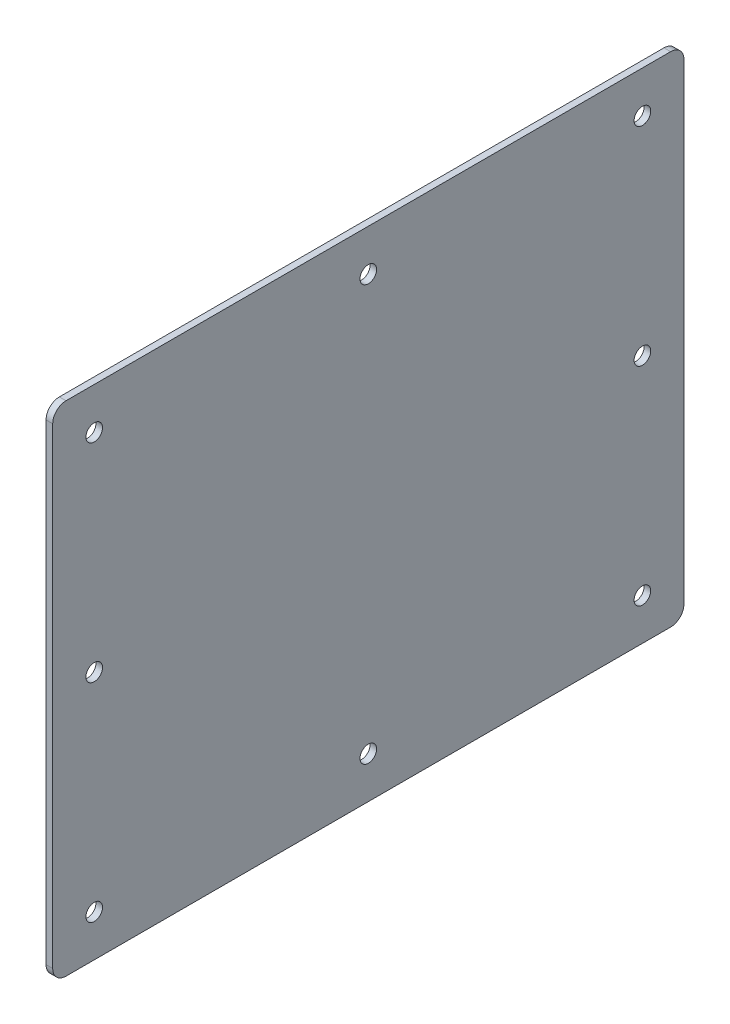
ISO-10303-21;
HEADER;
FILE_DESCRIPTION(('STEP AP214'),'2;1');
FILE_NAME('part.step','',(''),(''),'','','');
FILE_SCHEMA(('AUTOMOTIVE_DESIGN { 1 0 10303 214 1 1 1 1 }'));
ENDSEC;
DATA;
#1=APPLICATION_CONTEXT('core data for automotive mechanical design processes');
#2=APPLICATION_PROTOCOL_DEFINITION('international standard','automotive_design',2000,#1);
#3=PRODUCT_CONTEXT('',#1,'mechanical');
#4=PRODUCT('Part','Part','',(#3));
#5=PRODUCT_RELATED_PRODUCT_CATEGORY('part','',(#4));
#6=PRODUCT_DEFINITION_FORMATION('','',#4);
#7=PRODUCT_DEFINITION_CONTEXT('part definition',#1,'design');
#8=PRODUCT_DEFINITION('design','',#6,#7);
#9=PRODUCT_DEFINITION_SHAPE('','',#8);
#10=(LENGTH_UNIT() NAMED_UNIT(*) SI_UNIT(.MILLI.,.METRE.));
#11=(NAMED_UNIT(*) PLANE_ANGLE_UNIT() SI_UNIT($,.RADIAN.));
#12=(NAMED_UNIT(*) SI_UNIT($,.STERADIAN.) SOLID_ANGLE_UNIT());
#13=UNCERTAINTY_MEASURE_WITH_UNIT(LENGTH_MEASURE(1.E-05),#10,'distance_accuracy_value','');
#14=(GEOMETRIC_REPRESENTATION_CONTEXT(3) GLOBAL_UNCERTAINTY_ASSIGNED_CONTEXT((#13)) GLOBAL_UNIT_ASSIGNED_CONTEXT((#10,
#11,#12)) REPRESENTATION_CONTEXT('',''));
#15=CARTESIAN_POINT('',(0.,0.,0.));
#16=DIRECTION('',(0.,0.,1.));
#17=DIRECTION('',(1.,0.,0.));
#18=AXIS2_PLACEMENT_3D('',#15,#16,#17);
#19=CARTESIAN_POINT('',(2.54,95.25,120.65));
#20=DIRECTION('',(0.,-1.,0.));
#21=DIRECTION('',(0.,0.,-1.));
#22=AXIS2_PLACEMENT_3D('',#19,#20,#21);
#23=PLANE('',#22);
#24=DIRECTION('',(0.,0.,1.));
#25=VECTOR('',#24,1.);
#26=CARTESIAN_POINT('',(2.54,95.25,120.65));
#27=LINE('',#26,#25);
#28=CARTESIAN_POINT('',(2.54,95.25,-115.57));
#29=VERTEX_POINT('',#28);
#30=CARTESIAN_POINT('',(2.54,95.25,115.57));
#31=VERTEX_POINT('',#30);
#32=EDGE_CURVE('E130',#29,#31,#27,.T.);
#33=ORIENTED_EDGE('',*,*,#32,.F.);
#34=DIRECTION('',(-1.,0.,0.));
#35=VECTOR('',#34,1.);
#36=CARTESIAN_POINT('',(2.54,95.25,-115.57));
#37=LINE('',#36,#35);
#38=CARTESIAN_POINT('',(0.,95.25,-115.57));
#39=VERTEX_POINT('',#38);
#40=EDGE_CURVE('E115',#29,#39,#37,.T.);
#41=ORIENTED_EDGE('',*,*,#40,.T.);
#42=DIRECTION('',(0.,0.,1.));
#43=VECTOR('',#42,1.);
#44=CARTESIAN_POINT('',(0.,95.25,120.65));
#45=LINE('',#44,#43);
#46=CARTESIAN_POINT('',(0.,95.25,115.57));
#47=VERTEX_POINT('',#46);
#48=EDGE_CURVE('E127',#39,#47,#45,.T.);
#49=ORIENTED_EDGE('',*,*,#48,.T.);
#50=DIRECTION('',(-1.,0.,0.));
#51=VECTOR('',#50,1.);
#52=CARTESIAN_POINT('',(2.54,95.25,115.57));
#53=LINE('',#52,#51);
#54=EDGE_CURVE('E132',#47,#31,#53,.F.);
#55=ORIENTED_EDGE('',*,*,#54,.T.);
#56=EDGE_LOOP('',(#33,#41,#49,#55));
#57=FACE_BOUND('',#56,.T.);
#58=ADVANCED_FACE('F45',(#57),#23,.F.);
#59=CARTESIAN_POINT('',(2.54,-95.25,120.65));
#60=DIRECTION('',(0.,0.,-1.));
#61=DIRECTION('',(-1.,0.,0.));
#62=AXIS2_PLACEMENT_3D('',#59,#60,#61);
#63=PLANE('',#62);
#64=DIRECTION('',(0.,-1.,0.));
#65=VECTOR('',#64,1.);
#66=CARTESIAN_POINT('',(0.,-95.25,120.65));
#67=LINE('',#66,#65);
#68=CARTESIAN_POINT('',(0.,90.17,120.65));
#69=VERTEX_POINT('',#68);
#70=CARTESIAN_POINT('',(0.,-90.17,120.65));
#71=VERTEX_POINT('',#70);
#72=EDGE_CURVE('E136',#69,#71,#67,.T.);
#73=ORIENTED_EDGE('',*,*,#72,.T.);
#74=DIRECTION('',(-1.,0.,0.));
#75=VECTOR('',#74,1.);
#76=CARTESIAN_POINT('',(2.54,-90.17,120.65));
#77=LINE('',#76,#75);
#78=CARTESIAN_POINT('',(2.54,-90.17,120.65));
#79=VERTEX_POINT('',#78);
#80=EDGE_CURVE('E11',#71,#79,#77,.F.);
#81=ORIENTED_EDGE('',*,*,#80,.T.);
#82=DIRECTION('',(0.,-1.,0.));
#83=VECTOR('',#82,1.);
#84=CARTESIAN_POINT('',(2.54,-95.25,120.65));
#85=LINE('',#84,#83);
#86=CARTESIAN_POINT('',(2.54,90.17,120.65));
#87=VERTEX_POINT('',#86);
#88=EDGE_CURVE('E176',#87,#79,#85,.T.);
#89=ORIENTED_EDGE('',*,*,#88,.F.);
#90=DIRECTION('',(-1.,0.,0.));
#91=VECTOR('',#90,1.);
#92=CARTESIAN_POINT('',(2.54,90.17,120.65));
#93=LINE('',#92,#91);
#94=EDGE_CURVE('E53',#87,#69,#93,.T.);
#95=ORIENTED_EDGE('',*,*,#94,.T.);
#96=EDGE_LOOP('',(#73,#81,#89,#95));
#97=FACE_BOUND('',#96,.T.);
#98=ADVANCED_FACE('F174',(#97),#63,.F.);
#99=CARTESIAN_POINT('',(2.54,-95.25,120.65));
#100=DIRECTION('',(0.,1.,0.));
#101=DIRECTION('',(0.,0.,1.));
#102=AXIS2_PLACEMENT_3D('',#99,#100,#101);
#103=PLANE('',#102);
#104=DIRECTION('',(0.,0.,-1.));
#105=VECTOR('',#104,1.);
#106=CARTESIAN_POINT('',(0.,-95.25,120.65));
#107=LINE('',#106,#105);
#108=CARTESIAN_POINT('',(0.,-95.25,115.57));
#109=VERTEX_POINT('',#108);
#110=CARTESIAN_POINT('',(0.,-95.25,-115.57));
#111=VERTEX_POINT('',#110);
#112=EDGE_CURVE('E140',#109,#111,#107,.T.);
#113=ORIENTED_EDGE('',*,*,#112,.T.);
#114=DIRECTION('',(-1.,0.,0.));
#115=VECTOR('',#114,1.);
#116=CARTESIAN_POINT('',(2.54,-95.25,-115.57));
#117=LINE('',#116,#115);
#118=CARTESIAN_POINT('',(2.54,-95.25,-115.57));
#119=VERTEX_POINT('',#118);
#120=EDGE_CURVE('E60',#111,#119,#117,.F.);
#121=ORIENTED_EDGE('',*,*,#120,.T.);
#122=DIRECTION('',(0.,0.,-1.));
#123=VECTOR('',#122,1.);
#124=CARTESIAN_POINT('',(2.54,-95.25,120.65));
#125=LINE('',#124,#123);
#126=CARTESIAN_POINT('',(2.54,-95.25,115.57));
#127=VERTEX_POINT('',#126);
#128=EDGE_CURVE('E184',#127,#119,#125,.T.);
#129=ORIENTED_EDGE('',*,*,#128,.F.);
#130=DIRECTION('',(-1.,0.,0.));
#131=VECTOR('',#130,1.);
#132=CARTESIAN_POINT('',(2.54,-95.25,115.57));
#133=LINE('',#132,#131);
#134=EDGE_CURVE('E167',#127,#109,#133,.T.);
#135=ORIENTED_EDGE('',*,*,#134,.T.);
#136=EDGE_LOOP('',(#113,#121,#129,#135));
#137=FACE_BOUND('',#136,.T.);
#138=ADVANCED_FACE('F183',(#137),#103,.F.);
#139=CARTESIAN_POINT('',(2.54,-95.25,-120.65));
#140=DIRECTION('',(0.,0.,1.));
#141=DIRECTION('',(1.,0.,0.));
#142=AXIS2_PLACEMENT_3D('',#139,#140,#141);
#143=PLANE('',#142);
#144=DIRECTION('',(0.,1.,0.));
#145=VECTOR('',#144,1.);
#146=CARTESIAN_POINT('',(0.,-95.25,-120.65));
#147=LINE('',#146,#145);
#148=CARTESIAN_POINT('',(0.,-90.17,-120.65));
#149=VERTEX_POINT('',#148);
#150=CARTESIAN_POINT('',(0.,90.17,-120.65));
#151=VERTEX_POINT('',#150);
#152=EDGE_CURVE('E150',#149,#151,#147,.T.);
#153=ORIENTED_EDGE('',*,*,#152,.T.);
#154=DIRECTION('',(-1.,0.,0.));
#155=VECTOR('',#154,1.);
#156=CARTESIAN_POINT('',(2.54,90.17,-120.65));
#157=LINE('',#156,#155);
#158=CARTESIAN_POINT('',(2.54,90.17,-120.65));
#159=VERTEX_POINT('',#158);
#160=EDGE_CURVE('E116',#151,#159,#157,.F.);
#161=ORIENTED_EDGE('',*,*,#160,.T.);
#162=DIRECTION('',(0.,1.,0.));
#163=VECTOR('',#162,1.);
#164=CARTESIAN_POINT('',(2.54,-95.25,-120.65));
#165=LINE('',#164,#163);
#166=CARTESIAN_POINT('',(2.54,-90.17,-120.65));
#167=VERTEX_POINT('',#166);
#168=EDGE_CURVE('E146',#167,#159,#165,.T.);
#169=ORIENTED_EDGE('',*,*,#168,.F.);
#170=DIRECTION('',(-1.,0.,0.));
#171=VECTOR('',#170,1.);
#172=CARTESIAN_POINT('',(2.54,-90.17,-120.65));
#173=LINE('',#172,#171);
#174=EDGE_CURVE('E121',#167,#149,#173,.T.);
#175=ORIENTED_EDGE('',*,*,#174,.T.);
#176=EDGE_LOOP('',(#153,#161,#169,#175));
#177=FACE_BOUND('',#176,.T.);
#178=ADVANCED_FACE('F281',(#177),#143,.F.);
#179=CARTESIAN_POINT('',(2.54,0.,0.));
#180=DIRECTION('',(1.,0.,0.));
#181=DIRECTION('',(0.,0.,-1.));
#182=AXIS2_PLACEMENT_3D('',#179,#180,#181);
#183=PLANE('',#182);
#184=CARTESIAN_POINT('',(2.54,-79.3750000000014,7.21644966006352E-13));
#185=DIRECTION('',(1.,0.,0.));
#186=DIRECTION('',(0.,0.,-1.));
#187=AXIS2_PLACEMENT_3D('',#184,#185,#186);
#188=CIRCLE('',#187,3.17499999999998);
#189=CARTESIAN_POINT('',(2.54,-79.3750000000014,-3.17499999999926));
#190=VERTEX_POINT('',#189);
#191=EDGE_CURVE('E137',#190,#190,#188,.T.);
#192=ORIENTED_EDGE('',*,*,#191,.F.);
#193=EDGE_LOOP('',(#192));
#194=FACE_BOUND('',#193,.T.);
#195=CARTESIAN_POINT('',(2.54,-79.375000000001,104.775000000001));
#196=DIRECTION('',(1.,0.,0.));
#197=DIRECTION('',(0.,0.,-1.));
#198=AXIS2_PLACEMENT_3D('',#195,#196,#197);
#199=CIRCLE('',#198,3.17500000000001);
#200=CARTESIAN_POINT('',(2.54,-79.375000000001,101.600000000001));
#201=VERTEX_POINT('',#200);
#202=EDGE_CURVE('E143',#201,#201,#199,.T.);
#203=ORIENTED_EDGE('',*,*,#202,.F.);
#204=EDGE_LOOP('',(#203));
#205=FACE_BOUND('',#204,.T.);
#206=CARTESIAN_POINT('',(2.54,79.374999999999,104.775));
#207=DIRECTION('',(1.,0.,0.));
#208=DIRECTION('',(0.,0.,-1.));
#209=AXIS2_PLACEMENT_3D('',#206,#207,#208);
#210=CIRCLE('',#209,3.17500000000001);
#211=CARTESIAN_POINT('',(2.54,79.374999999999,101.6));
#212=VERTEX_POINT('',#211);
#213=EDGE_CURVE('E192',#212,#212,#210,.T.);
#214=ORIENTED_EDGE('',*,*,#213,.F.);
#215=EDGE_LOOP('',(#214));
#216=FACE_BOUND('',#215,.T.);
#217=CARTESIAN_POINT('',(2.54,-1.72084568816899E-12,-104.775));
#218=DIRECTION('',(1.,0.,0.));
#219=DIRECTION('',(0.,0.,-1.));
#220=AXIS2_PLACEMENT_3D('',#217,#218,#219);
#221=CIRCLE('',#220,3.17499999999998);
#222=CARTESIAN_POINT('',(2.54,-1.72084568816899E-12,-107.95));
#223=VERTEX_POINT('',#222);
#224=EDGE_CURVE('E195',#223,#223,#221,.T.);
#225=ORIENTED_EDGE('',*,*,#224,.F.);
#226=EDGE_LOOP('',(#225));
#227=FACE_BOUND('',#226,.T.);
#228=CARTESIAN_POINT('',(2.54,-8.88178419700125E-13,104.775));
#229=DIRECTION('',(1.,0.,0.));
#230=DIRECTION('',(0.,0.,-1.));
#231=AXIS2_PLACEMENT_3D('',#228,#229,#230);
#232=CIRCLE('',#231,3.17500000000001);
#233=CARTESIAN_POINT('',(2.54,-8.88178419700125E-13,101.6));
#234=VERTEX_POINT('',#233);
#235=EDGE_CURVE('E198',#234,#234,#232,.T.);
#236=ORIENTED_EDGE('',*,*,#235,.F.);
#237=EDGE_LOOP('',(#236));
#238=FACE_BOUND('',#237,.T.);
#239=CARTESIAN_POINT('',(2.54,-79.3750000000017,-104.774999999999));
#240=DIRECTION('',(1.,0.,0.));
#241=DIRECTION('',(0.,0.,-1.));
#242=AXIS2_PLACEMENT_3D('',#239,#240,#241);
#243=CIRCLE('',#242,3.17499999999998);
#244=CARTESIAN_POINT('',(2.54,-79.3750000000017,-107.949999999999));
#245=VERTEX_POINT('',#244);
#246=EDGE_CURVE('E201',#245,#245,#243,.T.);
#247=ORIENTED_EDGE('',*,*,#246,.F.);
#248=EDGE_LOOP('',(#247));
#249=FACE_BOUND('',#248,.T.);
#250=CARTESIAN_POINT('',(2.54,79.3749999999982,-104.775));
#251=DIRECTION('',(1.,0.,0.));
#252=DIRECTION('',(0.,0.,-1.));
#253=AXIS2_PLACEMENT_3D('',#250,#251,#252);
#254=CIRCLE('',#253,3.175);
#255=CARTESIAN_POINT('',(2.54,79.3749999999982,-107.95));
#256=VERTEX_POINT('',#255);
#257=EDGE_CURVE('E204',#256,#256,#254,.T.);
#258=ORIENTED_EDGE('',*,*,#257,.F.);
#259=EDGE_LOOP('',(#258));
#260=FACE_BOUND('',#259,.T.);
#261=CARTESIAN_POINT('',(2.54,79.3749999999987,1.66533453693773E-13));
#262=DIRECTION('',(1.,0.,0.));
#263=DIRECTION('',(0.,0.,-1.));
#264=AXIS2_PLACEMENT_3D('',#261,#262,#263);
#265=CIRCLE('',#264,3.175);
#266=CARTESIAN_POINT('',(2.54,79.3749999999987,-3.17499999999983));
#267=VERTEX_POINT('',#266);
#268=EDGE_CURVE('E207',#267,#267,#265,.T.);
#269=ORIENTED_EDGE('',*,*,#268,.F.);
#270=EDGE_LOOP('',(#269));
#271=FACE_BOUND('',#270,.T.);
#272=ORIENTED_EDGE('',*,*,#168,.T.);
#273=CARTESIAN_POINT('',(2.54,90.17,-115.57));
#274=DIRECTION('',(1.,0.,0.));
#275=DIRECTION('',(0.,0.,-1.));
#276=AXIS2_PLACEMENT_3D('',#273,#274,#275);
#277=CIRCLE('',#276,5.08);
#278=EDGE_CURVE('E165',#159,#29,#277,.T.);
#279=ORIENTED_EDGE('',*,*,#278,.T.);
#280=ORIENTED_EDGE('',*,*,#32,.T.);
#281=CARTESIAN_POINT('',(2.54,90.17,115.57));
#282=DIRECTION('',(1.,0.,0.));
#283=DIRECTION('',(0.,0.,-1.));
#284=AXIS2_PLACEMENT_3D('',#281,#282,#283);
#285=CIRCLE('',#284,5.08);
#286=EDGE_CURVE('E160',#31,#87,#285,.T.);
#287=ORIENTED_EDGE('',*,*,#286,.T.);
#288=ORIENTED_EDGE('',*,*,#88,.T.);
#289=CARTESIAN_POINT('',(2.54,-90.17,115.57));
#290=DIRECTION('',(1.,0.,0.));
#291=DIRECTION('',(0.,0.,-1.));
#292=AXIS2_PLACEMENT_3D('',#289,#290,#291);
#293=CIRCLE('',#292,5.08);
#294=EDGE_CURVE('E67',#79,#127,#293,.T.);
#295=ORIENTED_EDGE('',*,*,#294,.T.);
#296=ORIENTED_EDGE('',*,*,#128,.T.);
#297=CARTESIAN_POINT('',(2.54,-90.17,-115.57));
#298=DIRECTION('',(1.,0.,0.));
#299=DIRECTION('',(0.,0.,-1.));
#300=AXIS2_PLACEMENT_3D('',#297,#298,#299);
#301=CIRCLE('',#300,5.08);
#302=EDGE_CURVE('E163',#119,#167,#301,.T.);
#303=ORIENTED_EDGE('',*,*,#302,.T.);
#304=EDGE_LOOP('',(#272,#279,#280,#287,#288,#295,#296,#303));
#305=FACE_BOUND('',#304,.T.);
#306=ADVANCED_FACE('F277',(#194,#205,#216,#227,#238,#249,#260,#271,#305),#183,.T.);
#307=CARTESIAN_POINT('',(0.,0.,0.));
#308=DIRECTION('',(1.,0.,0.));
#309=DIRECTION('',(0.,0.,-1.));
#310=AXIS2_PLACEMENT_3D('',#307,#308,#309);
#311=PLANE('',#310);
#312=CARTESIAN_POINT('',(0.,-79.3750000000014,7.21644966006352E-13));
#313=DIRECTION('',(1.,0.,0.));
#314=DIRECTION('',(0.,0.,-1.));
#315=AXIS2_PLACEMENT_3D('',#312,#313,#314);
#316=CIRCLE('',#315,3.17499999999998);
#317=CARTESIAN_POINT('',(0.,-79.3750000000014,-3.17499999999926));
#318=VERTEX_POINT('',#317);
#319=EDGE_CURVE('E213',#318,#318,#316,.T.);
#320=ORIENTED_EDGE('',*,*,#319,.T.);
#321=EDGE_LOOP('',(#320));
#322=FACE_BOUND('',#321,.T.);
#323=CARTESIAN_POINT('',(0.,-79.375000000001,104.775000000001));
#324=DIRECTION('',(1.,0.,0.));
#325=DIRECTION('',(0.,0.,-1.));
#326=AXIS2_PLACEMENT_3D('',#323,#324,#325);
#327=CIRCLE('',#326,3.17500000000001);
#328=CARTESIAN_POINT('',(0.,-79.375000000001,101.600000000001));
#329=VERTEX_POINT('',#328);
#330=EDGE_CURVE('E221',#329,#329,#327,.T.);
#331=ORIENTED_EDGE('',*,*,#330,.T.);
#332=EDGE_LOOP('',(#331));
#333=FACE_BOUND('',#332,.T.);
#334=CARTESIAN_POINT('',(0.,79.374999999999,104.775));
#335=DIRECTION('',(1.,0.,0.));
#336=DIRECTION('',(0.,0.,-1.));
#337=AXIS2_PLACEMENT_3D('',#334,#335,#336);
#338=CIRCLE('',#337,3.17500000000001);
#339=CARTESIAN_POINT('',(0.,79.374999999999,101.6));
#340=VERTEX_POINT('',#339);
#341=EDGE_CURVE('E217',#340,#340,#338,.T.);
#342=ORIENTED_EDGE('',*,*,#341,.T.);
#343=EDGE_LOOP('',(#342));
#344=FACE_BOUND('',#343,.T.);
#345=CARTESIAN_POINT('',(0.,-1.72084568816899E-12,-104.775));
#346=DIRECTION('',(1.,0.,0.));
#347=DIRECTION('',(0.,0.,-1.));
#348=AXIS2_PLACEMENT_3D('',#345,#346,#347);
#349=CIRCLE('',#348,3.17499999999998);
#350=CARTESIAN_POINT('',(0.,-1.72084568816899E-12,-107.95));
#351=VERTEX_POINT('',#350);
#352=EDGE_CURVE('E214',#351,#351,#349,.T.);
#353=ORIENTED_EDGE('',*,*,#352,.T.);
#354=EDGE_LOOP('',(#353));
#355=FACE_BOUND('',#354,.T.);
#356=CARTESIAN_POINT('',(0.,-8.88178419700125E-13,104.775));
#357=DIRECTION('',(1.,0.,0.));
#358=DIRECTION('',(0.,0.,-1.));
#359=AXIS2_PLACEMENT_3D('',#356,#357,#358);
#360=CIRCLE('',#359,3.17500000000001);
#361=CARTESIAN_POINT('',(0.,-8.88178419700125E-13,101.6));
#362=VERTEX_POINT('',#361);
#363=EDGE_CURVE('E218',#362,#362,#360,.T.);
#364=ORIENTED_EDGE('',*,*,#363,.T.);
#365=EDGE_LOOP('',(#364));
#366=FACE_BOUND('',#365,.T.);
#367=CARTESIAN_POINT('',(0.,-79.3750000000017,-104.774999999999));
#368=DIRECTION('',(1.,0.,0.));
#369=DIRECTION('',(0.,0.,-1.));
#370=AXIS2_PLACEMENT_3D('',#367,#368,#369);
#371=CIRCLE('',#370,3.17499999999998);
#372=CARTESIAN_POINT('',(0.,-79.3750000000017,-107.949999999999));
#373=VERTEX_POINT('',#372);
#374=EDGE_CURVE('E229',#373,#373,#371,.T.);
#375=ORIENTED_EDGE('',*,*,#374,.T.);
#376=EDGE_LOOP('',(#375));
#377=FACE_BOUND('',#376,.T.);
#378=CARTESIAN_POINT('',(0.,79.3749999999982,-104.775));
#379=DIRECTION('',(1.,0.,0.));
#380=DIRECTION('',(0.,0.,-1.));
#381=AXIS2_PLACEMENT_3D('',#378,#379,#380);
#382=CIRCLE('',#381,3.175);
#383=CARTESIAN_POINT('',(0.,79.3749999999982,-107.95));
#384=VERTEX_POINT('',#383);
#385=EDGE_CURVE('E226',#384,#384,#382,.T.);
#386=ORIENTED_EDGE('',*,*,#385,.T.);
#387=EDGE_LOOP('',(#386));
#388=FACE_BOUND('',#387,.T.);
#389=CARTESIAN_POINT('',(0.,79.3749999999987,1.66533453693773E-13));
#390=DIRECTION('',(1.,0.,0.));
#391=DIRECTION('',(0.,0.,-1.));
#392=AXIS2_PLACEMENT_3D('',#389,#390,#391);
#393=CIRCLE('',#392,3.175);
#394=CARTESIAN_POINT('',(0.,79.3749999999987,-3.17499999999983));
#395=VERTEX_POINT('',#394);
#396=EDGE_CURVE('E210',#395,#395,#393,.T.);
#397=ORIENTED_EDGE('',*,*,#396,.T.);
#398=EDGE_LOOP('',(#397));
#399=FACE_BOUND('',#398,.T.);
#400=ORIENTED_EDGE('',*,*,#48,.F.);
#401=CARTESIAN_POINT('',(0.,90.17,-115.57));
#402=DIRECTION('',(1.,0.,0.));
#403=DIRECTION('',(0.,0.,-1.));
#404=AXIS2_PLACEMENT_3D('',#401,#402,#403);
#405=CIRCLE('',#404,5.08);
#406=EDGE_CURVE('E111',#39,#151,#405,.F.);
#407=ORIENTED_EDGE('',*,*,#406,.T.);
#408=ORIENTED_EDGE('',*,*,#152,.F.);
#409=CARTESIAN_POINT('',(0.,-90.17,-115.57));
#410=DIRECTION('',(1.,0.,0.));
#411=DIRECTION('',(0.,0.,-1.));
#412=AXIS2_PLACEMENT_3D('',#409,#410,#411);
#413=CIRCLE('',#412,5.08);
#414=EDGE_CURVE('E122',#149,#111,#413,.F.);
#415=ORIENTED_EDGE('',*,*,#414,.T.);
#416=ORIENTED_EDGE('',*,*,#112,.F.);
#417=CARTESIAN_POINT('',(0.,-90.17,115.57));
#418=DIRECTION('',(1.,0.,0.));
#419=DIRECTION('',(0.,0.,-1.));
#420=AXIS2_PLACEMENT_3D('',#417,#418,#419);
#421=CIRCLE('',#420,5.08);
#422=EDGE_CURVE('E154',#109,#71,#421,.F.);
#423=ORIENTED_EDGE('',*,*,#422,.T.);
#424=ORIENTED_EDGE('',*,*,#72,.F.);
#425=CARTESIAN_POINT('',(0.,90.17,115.57));
#426=DIRECTION('',(1.,0.,0.));
#427=DIRECTION('',(0.,0.,-1.));
#428=AXIS2_PLACEMENT_3D('',#425,#426,#427);
#429=CIRCLE('',#428,5.08);
#430=EDGE_CURVE('E131',#69,#47,#429,.F.);
#431=ORIENTED_EDGE('',*,*,#430,.T.);
#432=EDGE_LOOP('',(#400,#407,#408,#415,#416,#423,#424,#431));
#433=FACE_BOUND('',#432,.T.);
#434=ADVANCED_FACE('F134',(#322,#333,#344,#355,#366,#377,#388,#399,#433),#311,.F.);
#435=CARTESIAN_POINT('',(2.54,90.17,-115.57));
#436=DIRECTION('',(-1.,0.,0.));
#437=DIRECTION('',(0.,0.,1.));
#438=AXIS2_PLACEMENT_3D('',#435,#436,#437);
#439=CYLINDRICAL_SURFACE('',#438,5.08);
#440=ORIENTED_EDGE('',*,*,#278,.F.);
#441=ORIENTED_EDGE('',*,*,#160,.F.);
#442=ORIENTED_EDGE('',*,*,#406,.F.);
#443=ORIENTED_EDGE('',*,*,#40,.F.);
#444=EDGE_LOOP('',(#440,#441,#442,#443));
#445=FACE_BOUND('',#444,.T.);
#446=ADVANCED_FACE('F114',(#445),#439,.T.);
#447=CARTESIAN_POINT('',(2.54,-90.17,-115.57));
#448=DIRECTION('',(-1.,0.,0.));
#449=DIRECTION('',(0.,0.,1.));
#450=AXIS2_PLACEMENT_3D('',#447,#448,#449);
#451=CYLINDRICAL_SURFACE('',#450,5.08);
#452=ORIENTED_EDGE('',*,*,#302,.F.);
#453=ORIENTED_EDGE('',*,*,#120,.F.);
#454=ORIENTED_EDGE('',*,*,#414,.F.);
#455=ORIENTED_EDGE('',*,*,#174,.F.);
#456=EDGE_LOOP('',(#452,#453,#454,#455));
#457=FACE_BOUND('',#456,.T.);
#458=ADVANCED_FACE('F263',(#457),#451,.T.);
#459=CARTESIAN_POINT('',(2.54,-90.17,115.57));
#460=DIRECTION('',(-1.,0.,0.));
#461=DIRECTION('',(0.,0.,1.));
#462=AXIS2_PLACEMENT_3D('',#459,#460,#461);
#463=CYLINDRICAL_SURFACE('',#462,5.08);
#464=ORIENTED_EDGE('',*,*,#294,.F.);
#465=ORIENTED_EDGE('',*,*,#80,.F.);
#466=ORIENTED_EDGE('',*,*,#422,.F.);
#467=ORIENTED_EDGE('',*,*,#134,.F.);
#468=EDGE_LOOP('',(#464,#465,#466,#467));
#469=FACE_BOUND('',#468,.T.);
#470=ADVANCED_FACE('F182',(#469),#463,.T.);
#471=CARTESIAN_POINT('',(2.54,90.17,115.57));
#472=DIRECTION('',(-1.,0.,0.));
#473=DIRECTION('',(0.,0.,1.));
#474=AXIS2_PLACEMENT_3D('',#471,#472,#473);
#475=CYLINDRICAL_SURFACE('',#474,5.08);
#476=ORIENTED_EDGE('',*,*,#286,.F.);
#477=ORIENTED_EDGE('',*,*,#54,.F.);
#478=ORIENTED_EDGE('',*,*,#430,.F.);
#479=ORIENTED_EDGE('',*,*,#94,.F.);
#480=EDGE_LOOP('',(#476,#477,#478,#479));
#481=FACE_BOUND('',#480,.T.);
#482=ADVANCED_FACE('F47',(#481),#475,.T.);
#483=CARTESIAN_POINT('',(0.,79.3749999999987,1.66533453693773E-13));
#484=DIRECTION('',(1.,0.,0.));
#485=DIRECTION('',(0.,0.,-1.));
#486=AXIS2_PLACEMENT_3D('',#483,#484,#485);
#487=CYLINDRICAL_SURFACE('',#486,3.175);
#488=ORIENTED_EDGE('',*,*,#268,.T.);
#489=EDGE_LOOP('',(#488));
#490=FACE_BOUND('',#489,.T.);
#491=ORIENTED_EDGE('',*,*,#396,.F.);
#492=EDGE_LOOP('',(#491));
#493=FACE_BOUND('',#492,.T.);
#494=ADVANCED_FACE('F270',(#490,#493),#487,.F.);
#495=CARTESIAN_POINT('',(0.,79.3749999999982,-104.775));
#496=DIRECTION('',(1.,0.,0.));
#497=DIRECTION('',(0.,0.,-1.));
#498=AXIS2_PLACEMENT_3D('',#495,#496,#497);
#499=CYLINDRICAL_SURFACE('',#498,3.175);
#500=ORIENTED_EDGE('',*,*,#257,.T.);
#501=EDGE_LOOP('',(#500));
#502=FACE_BOUND('',#501,.T.);
#503=ORIENTED_EDGE('',*,*,#385,.F.);
#504=EDGE_LOOP('',(#503));
#505=FACE_BOUND('',#504,.T.);
#506=ADVANCED_FACE('F250',(#502,#505),#499,.F.);
#507=CARTESIAN_POINT('',(0.,-79.3750000000017,-104.774999999999));
#508=DIRECTION('',(1.,0.,0.));
#509=DIRECTION('',(0.,0.,-1.));
#510=AXIS2_PLACEMENT_3D('',#507,#508,#509);
#511=CYLINDRICAL_SURFACE('',#510,3.17499999999998);
#512=ORIENTED_EDGE('',*,*,#246,.T.);
#513=EDGE_LOOP('',(#512));
#514=FACE_BOUND('',#513,.T.);
#515=ORIENTED_EDGE('',*,*,#374,.F.);
#516=EDGE_LOOP('',(#515));
#517=FACE_BOUND('',#516,.T.);
#518=ADVANCED_FACE('F240',(#514,#517),#511,.F.);
#519=CARTESIAN_POINT('',(0.,-8.88178419700125E-13,104.775));
#520=DIRECTION('',(1.,0.,0.));
#521=DIRECTION('',(0.,0.,-1.));
#522=AXIS2_PLACEMENT_3D('',#519,#520,#521);
#523=CYLINDRICAL_SURFACE('',#522,3.17500000000001);
#524=ORIENTED_EDGE('',*,*,#235,.T.);
#525=EDGE_LOOP('',(#524));
#526=FACE_BOUND('',#525,.T.);
#527=ORIENTED_EDGE('',*,*,#363,.F.);
#528=EDGE_LOOP('',(#527));
#529=FACE_BOUND('',#528,.T.);
#530=ADVANCED_FACE('F237',(#526,#529),#523,.F.);
#531=CARTESIAN_POINT('',(0.,-1.72084568816899E-12,-104.775));
#532=DIRECTION('',(1.,0.,0.));
#533=DIRECTION('',(0.,0.,-1.));
#534=AXIS2_PLACEMENT_3D('',#531,#532,#533);
#535=CYLINDRICAL_SURFACE('',#534,3.17499999999998);
#536=ORIENTED_EDGE('',*,*,#224,.T.);
#537=EDGE_LOOP('',(#536));
#538=FACE_BOUND('',#537,.T.);
#539=ORIENTED_EDGE('',*,*,#352,.F.);
#540=EDGE_LOOP('',(#539));
#541=FACE_BOUND('',#540,.T.);
#542=ADVANCED_FACE('F239',(#538,#541),#535,.F.);
#543=CARTESIAN_POINT('',(0.,79.374999999999,104.775));
#544=DIRECTION('',(1.,0.,0.));
#545=DIRECTION('',(0.,0.,-1.));
#546=AXIS2_PLACEMENT_3D('',#543,#544,#545);
#547=CYLINDRICAL_SURFACE('',#546,3.17500000000001);
#548=ORIENTED_EDGE('',*,*,#213,.T.);
#549=EDGE_LOOP('',(#548));
#550=FACE_BOUND('',#549,.T.);
#551=ORIENTED_EDGE('',*,*,#341,.F.);
#552=EDGE_LOOP('',(#551));
#553=FACE_BOUND('',#552,.T.);
#554=ADVANCED_FACE('F247',(#550,#553),#547,.F.);
#555=CARTESIAN_POINT('',(0.,-79.375000000001,104.775000000001));
#556=DIRECTION('',(1.,0.,0.));
#557=DIRECTION('',(0.,0.,-1.));
#558=AXIS2_PLACEMENT_3D('',#555,#556,#557);
#559=CYLINDRICAL_SURFACE('',#558,3.17500000000001);
#560=ORIENTED_EDGE('',*,*,#202,.T.);
#561=EDGE_LOOP('',(#560));
#562=FACE_BOUND('',#561,.T.);
#563=ORIENTED_EDGE('',*,*,#330,.F.);
#564=EDGE_LOOP('',(#563));
#565=FACE_BOUND('',#564,.T.);
#566=ADVANCED_FACE('F295',(#562,#565),#559,.F.);
#567=CARTESIAN_POINT('',(0.,-79.3750000000014,7.21644966006352E-13));
#568=DIRECTION('',(1.,0.,0.));
#569=DIRECTION('',(0.,0.,-1.));
#570=AXIS2_PLACEMENT_3D('',#567,#568,#569);
#571=CYLINDRICAL_SURFACE('',#570,3.17499999999998);
#572=ORIENTED_EDGE('',*,*,#191,.T.);
#573=EDGE_LOOP('',(#572));
#574=FACE_BOUND('',#573,.T.);
#575=ORIENTED_EDGE('',*,*,#319,.F.);
#576=EDGE_LOOP('',(#575));
#577=FACE_BOUND('',#576,.T.);
#578=ADVANCED_FACE('F299',(#574,#577),#571,.F.);
#579=CLOSED_SHELL('',(#58,#98,#138,#178,#306,#434,#446,#458,#470,#482,#494,#506,#518,#530,#542,
#554,#566,#578));
#580=MANIFOLD_SOLID_BREP('B2',#579);
#581=ADVANCED_BREP_SHAPE_REPRESENTATION('',(#18,#580),#14);
#582=SHAPE_DEFINITION_REPRESENTATION(#9,#581);
ENDSEC;
END-ISO-10303-21;
